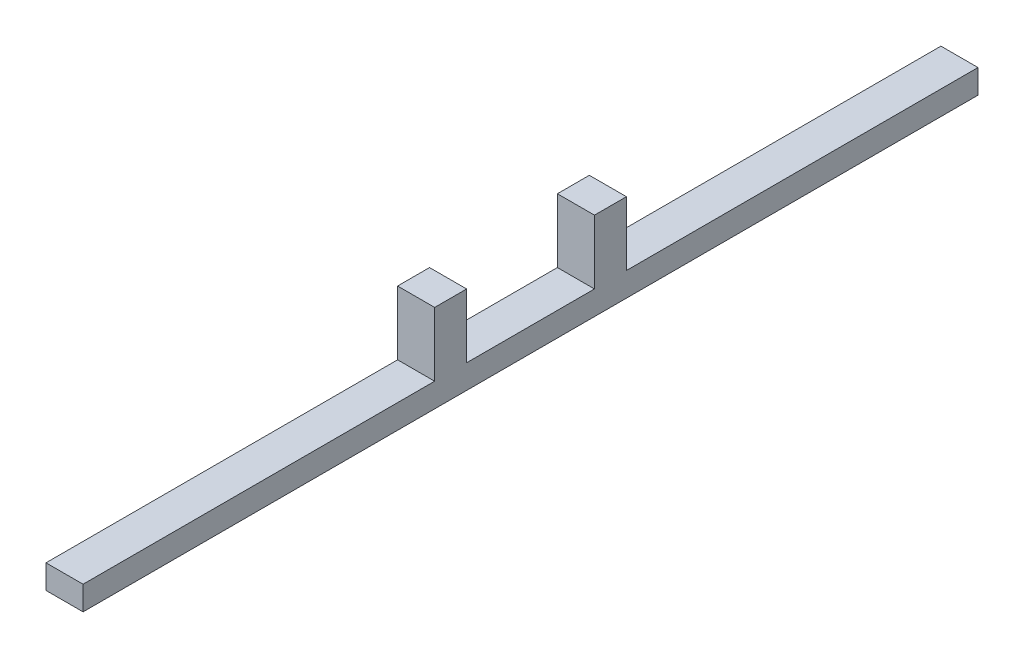
ISO-10303-21;
HEADER;
FILE_DESCRIPTION(('STEP AP214'),'2;1');
FILE_NAME('part.step','',(''),(''),'','','');
FILE_SCHEMA(('AUTOMOTIVE_DESIGN { 1 0 10303 214 1 1 1 1 }'));
ENDSEC;
DATA;
#1=APPLICATION_CONTEXT('core data for automotive mechanical design processes');
#2=APPLICATION_PROTOCOL_DEFINITION('international standard','automotive_design',2000,#1);
#3=PRODUCT_CONTEXT('',#1,'mechanical');
#4=PRODUCT('Part','Part','',(#3));
#5=PRODUCT_RELATED_PRODUCT_CATEGORY('part','',(#4));
#6=PRODUCT_DEFINITION_FORMATION('','',#4);
#7=PRODUCT_DEFINITION_CONTEXT('part definition',#1,'design');
#8=PRODUCT_DEFINITION('design','',#6,#7);
#9=PRODUCT_DEFINITION_SHAPE('','',#8);
#10=(LENGTH_UNIT() NAMED_UNIT(*) SI_UNIT(.MILLI.,.METRE.));
#11=(NAMED_UNIT(*) PLANE_ANGLE_UNIT() SI_UNIT($,.RADIAN.));
#12=(NAMED_UNIT(*) SI_UNIT($,.STERADIAN.) SOLID_ANGLE_UNIT());
#13=UNCERTAINTY_MEASURE_WITH_UNIT(LENGTH_MEASURE(1.E-05),#10,'distance_accuracy_value','');
#14=(GEOMETRIC_REPRESENTATION_CONTEXT(3) GLOBAL_UNCERTAINTY_ASSIGNED_CONTEXT((#13)) GLOBAL_UNIT_ASSIGNED_CONTEXT((#10,
#11,#12)) REPRESENTATION_CONTEXT('',''));
#15=CARTESIAN_POINT('',(0.,0.,0.));
#16=DIRECTION('',(0.,0.,1.));
#17=DIRECTION('',(1.,0.,0.));
#18=AXIS2_PLACEMENT_3D('',#15,#16,#17);
#19=CARTESIAN_POINT('',(-14.732,0.,355.6));
#20=DIRECTION('',(0.,-1.,0.));
#21=DIRECTION('',(0.,0.,-1.));
#22=AXIS2_PLACEMENT_3D('',#19,#20,#21);
#23=PLANE('',#22);
#24=DIRECTION('',(1.,0.,0.));
#25=VECTOR('',#24,1.);
#26=CARTESIAN_POINT('',(-14.732,0.,76.2));
#27=LINE('',#26,#25);
#28=CARTESIAN_POINT('',(-14.732,0.,76.2));
#29=VERTEX_POINT('',#28);
#30=CARTESIAN_POINT('',(14.732,0.,76.2));
#31=VERTEX_POINT('',#30);
#32=EDGE_CURVE('E222',#29,#31,#27,.T.);
#33=ORIENTED_EDGE('',*,*,#32,.F.);
#34=DIRECTION('',(0.,0.,-1.));
#35=VECTOR('',#34,1.);
#36=CARTESIAN_POINT('',(-14.732,0.,355.6));
#37=LINE('',#36,#35);
#38=CARTESIAN_POINT('',(-14.732,0.,355.6));
#39=VERTEX_POINT('',#38);
#40=EDGE_CURVE('E145',#39,#29,#37,.T.);
#41=ORIENTED_EDGE('',*,*,#40,.F.);
#42=DIRECTION('',(-1.,0.,0.));
#43=VECTOR('',#42,1.);
#44=CARTESIAN_POINT('',(-14.732,0.,355.6));
#45=LINE('',#44,#43);
#46=CARTESIAN_POINT('',(14.732,0.,355.6));
#47=VERTEX_POINT('',#46);
#48=EDGE_CURVE('E183',#47,#39,#45,.T.);
#49=ORIENTED_EDGE('',*,*,#48,.F.);
#50=DIRECTION('',(0.,0.,-1.));
#51=VECTOR('',#50,1.);
#52=CARTESIAN_POINT('',(14.732,0.,355.6));
#53=LINE('',#52,#51);
#54=EDGE_CURVE('E42',#47,#31,#53,.T.);
#55=ORIENTED_EDGE('',*,*,#54,.T.);
#56=EDGE_LOOP('',(#33,#41,#49,#55));
#57=FACE_BOUND('',#56,.T.);
#58=ADVANCED_FACE('F34',(#57),#23,.F.);
#59=DIRECTION('',(-1.,0.,0.));
#60=VECTOR('',#59,1.);
#61=CARTESIAN_POINT('',(-14.732,0.,50.8));
#62=LINE('',#61,#60);
#63=CARTESIAN_POINT('',(14.732,0.,50.8));
#64=VERTEX_POINT('',#63);
#65=CARTESIAN_POINT('',(-14.732,0.,50.8));
#66=VERTEX_POINT('',#65);
#67=EDGE_CURVE('E139',#64,#66,#62,.T.);
#68=ORIENTED_EDGE('',*,*,#67,.F.);
#69=CARTESIAN_POINT('',(14.732,0.,-50.8));
#70=VERTEX_POINT('',#69);
#71=EDGE_CURVE('E203',#64,#70,#53,.T.);
#72=ORIENTED_EDGE('',*,*,#71,.T.);
#73=DIRECTION('',(1.,0.,0.));
#74=VECTOR('',#73,1.);
#75=CARTESIAN_POINT('',(-14.732,0.,-50.8));
#76=LINE('',#75,#74);
#77=CARTESIAN_POINT('',(-14.732,0.,-50.8));
#78=VERTEX_POINT('',#77);
#79=EDGE_CURVE('E146',#78,#70,#76,.T.);
#80=ORIENTED_EDGE('',*,*,#79,.F.);
#81=EDGE_CURVE('E201',#66,#78,#37,.T.);
#82=ORIENTED_EDGE('',*,*,#81,.F.);
#83=EDGE_LOOP('',(#68,#72,#80,#82));
#84=FACE_BOUND('',#83,.T.);
#85=ADVANCED_FACE('F235',(#84),#23,.F.);
#86=DIRECTION('',(-1.,0.,0.));
#87=VECTOR('',#86,1.);
#88=CARTESIAN_POINT('',(-14.732,0.,-76.2));
#89=LINE('',#88,#87);
#90=CARTESIAN_POINT('',(14.732,0.,-76.2));
#91=VERTEX_POINT('',#90);
#92=CARTESIAN_POINT('',(-14.732,0.,-76.2));
#93=VERTEX_POINT('',#92);
#94=EDGE_CURVE('E57',#91,#93,#89,.T.);
#95=ORIENTED_EDGE('',*,*,#94,.F.);
#96=CARTESIAN_POINT('',(14.732,0.,-355.6));
#97=VERTEX_POINT('',#96);
#98=EDGE_CURVE('E200',#91,#97,#53,.T.);
#99=ORIENTED_EDGE('',*,*,#98,.T.);
#100=DIRECTION('',(-1.,0.,0.));
#101=VECTOR('',#100,1.);
#102=CARTESIAN_POINT('',(-14.732,0.,-355.6));
#103=LINE('',#102,#101);
#104=CARTESIAN_POINT('',(-14.732,0.,-355.6));
#105=VERTEX_POINT('',#104);
#106=EDGE_CURVE('E193',#97,#105,#103,.T.);
#107=ORIENTED_EDGE('',*,*,#106,.T.);
#108=EDGE_CURVE('E199',#93,#105,#37,.T.);
#109=ORIENTED_EDGE('',*,*,#108,.F.);
#110=EDGE_LOOP('',(#95,#99,#107,#109));
#111=FACE_BOUND('',#110,.T.);
#112=ADVANCED_FACE('F207',(#111),#23,.F.);
#113=CARTESIAN_POINT('',(-14.732,-19.05,355.6));
#114=DIRECTION('',(0.,1.,0.));
#115=DIRECTION('',(0.,0.,1.));
#116=AXIS2_PLACEMENT_3D('',#113,#114,#115);
#117=PLANE('',#116);
#118=DIRECTION('',(1.,0.,0.));
#119=VECTOR('',#118,1.);
#120=CARTESIAN_POINT('',(-14.732,-19.05,-355.6));
#121=LINE('',#120,#119);
#122=CARTESIAN_POINT('',(-14.732,-19.05,-355.6));
#123=VERTEX_POINT('',#122);
#124=CARTESIAN_POINT('',(14.732,-19.05,-355.6));
#125=VERTEX_POINT('',#124);
#126=EDGE_CURVE('E176',#123,#125,#121,.T.);
#127=ORIENTED_EDGE('',*,*,#126,.T.);
#128=DIRECTION('',(0.,0.,-1.));
#129=VECTOR('',#128,1.);
#130=CARTESIAN_POINT('',(14.732,-19.05,355.6));
#131=LINE('',#130,#129);
#132=CARTESIAN_POINT('',(14.732,-19.05,355.6));
#133=VERTEX_POINT('',#132);
#134=EDGE_CURVE('E11',#133,#125,#131,.T.);
#135=ORIENTED_EDGE('',*,*,#134,.F.);
#136=DIRECTION('',(1.,0.,0.));
#137=VECTOR('',#136,1.);
#138=CARTESIAN_POINT('',(-14.732,-19.05,355.6));
#139=LINE('',#138,#137);
#140=CARTESIAN_POINT('',(-14.732,-19.05,355.6));
#141=VERTEX_POINT('',#140);
#142=EDGE_CURVE('E177',#141,#133,#139,.T.);
#143=ORIENTED_EDGE('',*,*,#142,.F.);
#144=DIRECTION('',(0.,0.,-1.));
#145=VECTOR('',#144,1.);
#146=CARTESIAN_POINT('',(-14.732,-19.05,355.6));
#147=LINE('',#146,#145);
#148=EDGE_CURVE('E187',#141,#123,#147,.T.);
#149=ORIENTED_EDGE('',*,*,#148,.T.);
#150=EDGE_LOOP('',(#127,#135,#143,#149));
#151=FACE_BOUND('',#150,.T.);
#152=ADVANCED_FACE('F36',(#151),#117,.F.);
#153=CARTESIAN_POINT('',(14.732,0.,355.6));
#154=DIRECTION('',(-1.,0.,0.));
#155=DIRECTION('',(0.,0.,1.));
#156=AXIS2_PLACEMENT_3D('',#153,#154,#155);
#157=PLANE('',#156);
#158=DIRECTION('',(0.,1.,0.));
#159=VECTOR('',#158,1.);
#160=CARTESIAN_POINT('',(14.732,0.,-355.6));
#161=LINE('',#160,#159);
#162=EDGE_CURVE('E190',#125,#97,#161,.T.);
#163=ORIENTED_EDGE('',*,*,#162,.T.);
#164=ORIENTED_EDGE('',*,*,#98,.F.);
#165=DIRECTION('',(0.,-1.,0.));
#166=VECTOR('',#165,1.);
#167=CARTESIAN_POINT('',(14.732,50.8,-76.2));
#168=LINE('',#167,#166);
#169=CARTESIAN_POINT('',(14.732,50.8,-76.2));
#170=VERTEX_POINT('',#169);
#171=EDGE_CURVE('E167',#170,#91,#168,.T.);
#172=ORIENTED_EDGE('',*,*,#171,.F.);
#173=DIRECTION('',(0.,0.,-1.));
#174=VECTOR('',#173,1.);
#175=CARTESIAN_POINT('',(14.732,50.8,-76.2));
#176=LINE('',#175,#174);
#177=CARTESIAN_POINT('',(14.732,50.8,-50.8));
#178=VERTEX_POINT('',#177);
#179=EDGE_CURVE('E159',#178,#170,#176,.T.);
#180=ORIENTED_EDGE('',*,*,#179,.F.);
#181=DIRECTION('',(0.,-1.,0.));
#182=VECTOR('',#181,1.);
#183=CARTESIAN_POINT('',(14.732,50.8,-50.8));
#184=LINE('',#183,#182);
#185=EDGE_CURVE('E170',#178,#70,#184,.T.);
#186=ORIENTED_EDGE('',*,*,#185,.T.);
#187=ORIENTED_EDGE('',*,*,#71,.F.);
#188=DIRECTION('',(0.,-1.,0.));
#189=VECTOR('',#188,1.);
#190=CARTESIAN_POINT('',(14.732,50.8,50.8));
#191=LINE('',#190,#189);
#192=CARTESIAN_POINT('',(14.732,50.8,50.8));
#193=VERTEX_POINT('',#192);
#194=EDGE_CURVE('E150',#193,#64,#191,.T.);
#195=ORIENTED_EDGE('',*,*,#194,.F.);
#196=DIRECTION('',(0.,0.,-1.));
#197=VECTOR('',#196,1.);
#198=CARTESIAN_POINT('',(14.732,50.8,50.8));
#199=LINE('',#198,#197);
#200=CARTESIAN_POINT('',(14.732,50.8,76.2));
#201=VERTEX_POINT('',#200);
#202=EDGE_CURVE('E133',#201,#193,#199,.T.);
#203=ORIENTED_EDGE('',*,*,#202,.F.);
#204=DIRECTION('',(0.,-1.,0.));
#205=VECTOR('',#204,1.);
#206=CARTESIAN_POINT('',(14.732,50.8,76.2));
#207=LINE('',#206,#205);
#208=EDGE_CURVE('E130',#201,#31,#207,.T.);
#209=ORIENTED_EDGE('',*,*,#208,.T.);
#210=ORIENTED_EDGE('',*,*,#54,.F.);
#211=DIRECTION('',(0.,1.,0.));
#212=VECTOR('',#211,1.);
#213=CARTESIAN_POINT('',(14.732,0.,355.6));
#214=LINE('',#213,#212);
#215=EDGE_CURVE('E180',#133,#47,#214,.T.);
#216=ORIENTED_EDGE('',*,*,#215,.F.);
#217=ORIENTED_EDGE('',*,*,#134,.T.);
#218=EDGE_LOOP('',(#163,#164,#172,#180,#186,#187,#195,#203,#209,#210,#216,#217));
#219=FACE_BOUND('',#218,.T.);
#220=ADVANCED_FACE('F212',(#219),#157,.F.);
#221=CARTESIAN_POINT('',(-14.732,-19.05,355.6));
#222=DIRECTION('',(1.,0.,0.));
#223=DIRECTION('',(0.,0.,-1.));
#224=AXIS2_PLACEMENT_3D('',#221,#222,#223);
#225=PLANE('',#224);
#226=DIRECTION('',(0.,-1.,0.));
#227=VECTOR('',#226,1.);
#228=CARTESIAN_POINT('',(-14.732,-19.05,-355.6));
#229=LINE('',#228,#227);
#230=EDGE_CURVE('E181',#105,#123,#229,.T.);
#231=ORIENTED_EDGE('',*,*,#230,.T.);
#232=ORIENTED_EDGE('',*,*,#148,.F.);
#233=DIRECTION('',(0.,-1.,0.));
#234=VECTOR('',#233,1.);
#235=CARTESIAN_POINT('',(-14.732,-19.05,355.6));
#236=LINE('',#235,#234);
#237=EDGE_CURVE('E185',#39,#141,#236,.T.);
#238=ORIENTED_EDGE('',*,*,#237,.F.);
#239=ORIENTED_EDGE('',*,*,#40,.T.);
#240=DIRECTION('',(0.,-1.,0.));
#241=VECTOR('',#240,1.);
#242=CARTESIAN_POINT('',(-14.732,50.8,76.2));
#243=LINE('',#242,#241);
#244=CARTESIAN_POINT('',(-14.732,50.8,76.2));
#245=VERTEX_POINT('',#244);
#246=EDGE_CURVE('E127',#245,#29,#243,.T.);
#247=ORIENTED_EDGE('',*,*,#246,.F.);
#248=DIRECTION('',(0.,0.,1.));
#249=VECTOR('',#248,1.);
#250=CARTESIAN_POINT('',(-14.732,50.8,50.8));
#251=LINE('',#250,#249);
#252=CARTESIAN_POINT('',(-14.732,50.8,50.8));
#253=VERTEX_POINT('',#252);
#254=EDGE_CURVE('E134',#253,#245,#251,.T.);
#255=ORIENTED_EDGE('',*,*,#254,.F.);
#256=DIRECTION('',(0.,-1.,0.));
#257=VECTOR('',#256,1.);
#258=CARTESIAN_POINT('',(-14.732,50.8,50.8));
#259=LINE('',#258,#257);
#260=EDGE_CURVE('E49',#253,#66,#259,.T.);
#261=ORIENTED_EDGE('',*,*,#260,.T.);
#262=ORIENTED_EDGE('',*,*,#81,.T.);
#263=DIRECTION('',(0.,-1.,0.));
#264=VECTOR('',#263,1.);
#265=CARTESIAN_POINT('',(-14.732,50.8,-50.8));
#266=LINE('',#265,#264);
#267=CARTESIAN_POINT('',(-14.732,50.8,-50.8));
#268=VERTEX_POINT('',#267);
#269=EDGE_CURVE('E173',#268,#78,#266,.T.);
#270=ORIENTED_EDGE('',*,*,#269,.F.);
#271=DIRECTION('',(0.,0.,1.));
#272=VECTOR('',#271,1.);
#273=CARTESIAN_POINT('',(-14.732,50.8,-76.2));
#274=LINE('',#273,#272);
#275=CARTESIAN_POINT('',(-14.732,50.8,-76.2));
#276=VERTEX_POINT('',#275);
#277=EDGE_CURVE('E154',#276,#268,#274,.T.);
#278=ORIENTED_EDGE('',*,*,#277,.F.);
#279=DIRECTION('',(0.,-1.,0.));
#280=VECTOR('',#279,1.);
#281=CARTESIAN_POINT('',(-14.732,50.8,-76.2));
#282=LINE('',#281,#280);
#283=EDGE_CURVE('E162',#276,#93,#282,.T.);
#284=ORIENTED_EDGE('',*,*,#283,.T.);
#285=ORIENTED_EDGE('',*,*,#108,.T.);
#286=EDGE_LOOP('',(#231,#232,#238,#239,#247,#255,#261,#262,#270,#278,#284,#285));
#287=FACE_BOUND('',#286,.T.);
#288=ADVANCED_FACE('F142',(#287),#225,.F.);
#289=CARTESIAN_POINT('',(0.,0.,355.6));
#290=DIRECTION('',(0.,0.,-1.));
#291=DIRECTION('',(-1.,0.,0.));
#292=AXIS2_PLACEMENT_3D('',#289,#290,#291);
#293=PLANE('',#292);
#294=ORIENTED_EDGE('',*,*,#142,.T.);
#295=ORIENTED_EDGE('',*,*,#215,.T.);
#296=ORIENTED_EDGE('',*,*,#48,.T.);
#297=ORIENTED_EDGE('',*,*,#237,.T.);
#298=EDGE_LOOP('',(#294,#295,#296,#297));
#299=FACE_BOUND('',#298,.T.);
#300=ADVANCED_FACE('F221',(#299),#293,.F.);
#301=CARTESIAN_POINT('',(0.,0.,-355.6));
#302=DIRECTION('',(0.,0.,-1.));
#303=DIRECTION('',(-1.,0.,0.));
#304=AXIS2_PLACEMENT_3D('',#301,#302,#303);
#305=PLANE('',#304);
#306=ORIENTED_EDGE('',*,*,#126,.F.);
#307=ORIENTED_EDGE('',*,*,#230,.F.);
#308=ORIENTED_EDGE('',*,*,#106,.F.);
#309=ORIENTED_EDGE('',*,*,#162,.F.);
#310=EDGE_LOOP('',(#306,#307,#308,#309));
#311=FACE_BOUND('',#310,.T.);
#312=ADVANCED_FACE('F216',(#311),#305,.T.);
#313=CARTESIAN_POINT('',(-14.732,50.8,-50.8));
#314=DIRECTION('',(0.,0.,-1.));
#315=DIRECTION('',(-1.,0.,0.));
#316=AXIS2_PLACEMENT_3D('',#313,#314,#315);
#317=PLANE('',#316);
#318=ORIENTED_EDGE('',*,*,#79,.T.);
#319=ORIENTED_EDGE('',*,*,#185,.F.);
#320=DIRECTION('',(1.,0.,0.));
#321=VECTOR('',#320,1.);
#322=CARTESIAN_POINT('',(-14.732,50.8,-50.8));
#323=LINE('',#322,#321);
#324=EDGE_CURVE('E157',#268,#178,#323,.T.);
#325=ORIENTED_EDGE('',*,*,#324,.F.);
#326=ORIENTED_EDGE('',*,*,#269,.T.);
#327=EDGE_LOOP('',(#318,#319,#325,#326));
#328=FACE_BOUND('',#327,.T.);
#329=ADVANCED_FACE('F240',(#328),#317,.F.);
#330=CARTESIAN_POINT('',(-14.732,50.8,-76.2));
#331=DIRECTION('',(0.,0.,1.));
#332=DIRECTION('',(1.,0.,0.));
#333=AXIS2_PLACEMENT_3D('',#330,#331,#332);
#334=PLANE('',#333);
#335=ORIENTED_EDGE('',*,*,#94,.T.);
#336=ORIENTED_EDGE('',*,*,#283,.F.);
#337=DIRECTION('',(-1.,0.,0.));
#338=VECTOR('',#337,1.);
#339=CARTESIAN_POINT('',(-14.732,50.8,-76.2));
#340=LINE('',#339,#338);
#341=EDGE_CURVE('E161',#170,#276,#340,.T.);
#342=ORIENTED_EDGE('',*,*,#341,.F.);
#343=ORIENTED_EDGE('',*,*,#171,.T.);
#344=EDGE_LOOP('',(#335,#336,#342,#343));
#345=FACE_BOUND('',#344,.T.);
#346=ADVANCED_FACE('F248',(#345),#334,.F.);
#347=CARTESIAN_POINT('',(0.,50.8,0.));
#348=DIRECTION('',(0.,1.,0.));
#349=DIRECTION('',(0.,0.,1.));
#350=AXIS2_PLACEMENT_3D('',#347,#348,#349);
#351=PLANE('',#350);
#352=ORIENTED_EDGE('',*,*,#277,.T.);
#353=ORIENTED_EDGE('',*,*,#324,.T.);
#354=ORIENTED_EDGE('',*,*,#179,.T.);
#355=ORIENTED_EDGE('',*,*,#341,.T.);
#356=EDGE_LOOP('',(#352,#353,#354,#355));
#357=FACE_BOUND('',#356,.T.);
#358=ADVANCED_FACE('F245',(#357),#351,.T.);
#359=CARTESIAN_POINT('',(-14.732,50.8,76.2));
#360=DIRECTION('',(0.,0.,-1.));
#361=DIRECTION('',(-1.,0.,0.));
#362=AXIS2_PLACEMENT_3D('',#359,#360,#361);
#363=PLANE('',#362);
#364=ORIENTED_EDGE('',*,*,#32,.T.);
#365=ORIENTED_EDGE('',*,*,#208,.F.);
#366=DIRECTION('',(1.,0.,0.));
#367=VECTOR('',#366,1.);
#368=CARTESIAN_POINT('',(-14.732,50.8,76.2));
#369=LINE('',#368,#367);
#370=EDGE_CURVE('E123',#245,#201,#369,.T.);
#371=ORIENTED_EDGE('',*,*,#370,.F.);
#372=ORIENTED_EDGE('',*,*,#246,.T.);
#373=EDGE_LOOP('',(#364,#365,#371,#372));
#374=FACE_BOUND('',#373,.T.);
#375=ADVANCED_FACE('F125',(#374),#363,.F.);
#376=CARTESIAN_POINT('',(-14.732,50.8,50.8));
#377=DIRECTION('',(0.,0.,1.));
#378=DIRECTION('',(1.,0.,0.));
#379=AXIS2_PLACEMENT_3D('',#376,#377,#378);
#380=PLANE('',#379);
#381=ORIENTED_EDGE('',*,*,#67,.T.);
#382=ORIENTED_EDGE('',*,*,#260,.F.);
#383=DIRECTION('',(-1.,0.,0.));
#384=VECTOR('',#383,1.);
#385=CARTESIAN_POINT('',(-14.732,50.8,50.8));
#386=LINE('',#385,#384);
#387=EDGE_CURVE('E138',#193,#253,#386,.T.);
#388=ORIENTED_EDGE('',*,*,#387,.F.);
#389=ORIENTED_EDGE('',*,*,#194,.T.);
#390=EDGE_LOOP('',(#381,#382,#388,#389));
#391=FACE_BOUND('',#390,.T.);
#392=ADVANCED_FACE('F231',(#391),#380,.F.);
#393=CARTESIAN_POINT('',(0.,50.8,0.));
#394=DIRECTION('',(0.,1.,0.));
#395=DIRECTION('',(0.,0.,1.));
#396=AXIS2_PLACEMENT_3D('',#393,#394,#395);
#397=PLANE('',#396);
#398=ORIENTED_EDGE('',*,*,#254,.T.);
#399=ORIENTED_EDGE('',*,*,#370,.T.);
#400=ORIENTED_EDGE('',*,*,#202,.T.);
#401=ORIENTED_EDGE('',*,*,#387,.T.);
#402=EDGE_LOOP('',(#398,#399,#400,#401));
#403=FACE_BOUND('',#402,.T.);
#404=ADVANCED_FACE('F136',(#403),#397,.T.);
#405=CLOSED_SHELL('',(#58,#85,#112,#152,#220,#288,#300,#312,#329,#346,#358,#375,#392,#404));
#406=MANIFOLD_SOLID_BREP('B2',#405);
#407=ADVANCED_BREP_SHAPE_REPRESENTATION('',(#18,#406),#14);
#408=SHAPE_DEFINITION_REPRESENTATION(#9,#407);
ENDSEC;
END-ISO-10303-21;
